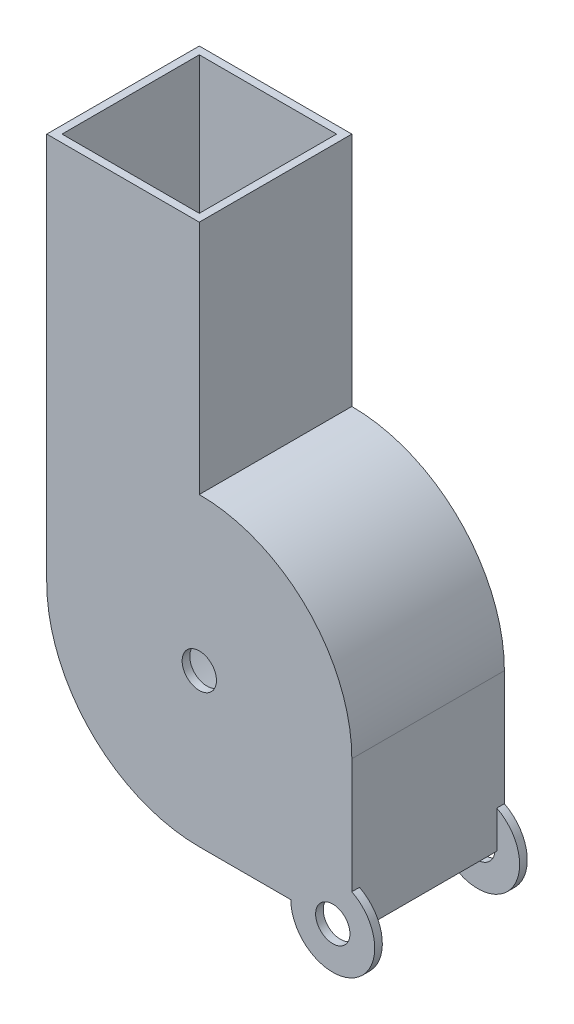
ISO-10303-21;
HEADER;
FILE_DESCRIPTION(('STEP AP214'),'2;1');
FILE_NAME('part.step','',(''),(''),'','','');
FILE_SCHEMA(('AUTOMOTIVE_DESIGN { 1 0 10303 214 1 1 1 1 }'));
ENDSEC;
DATA;
#1=APPLICATION_CONTEXT('core data for automotive mechanical design processes');
#2=APPLICATION_PROTOCOL_DEFINITION('international standard','automotive_design',2000,#1);
#3=PRODUCT_CONTEXT('',#1,'mechanical');
#4=PRODUCT('Part','Part','',(#3));
#5=PRODUCT_RELATED_PRODUCT_CATEGORY('part','',(#4));
#6=PRODUCT_DEFINITION_FORMATION('','',#4);
#7=PRODUCT_DEFINITION_CONTEXT('part definition',#1,'design');
#8=PRODUCT_DEFINITION('design','',#6,#7);
#9=PRODUCT_DEFINITION_SHAPE('','',#8);
#10=(LENGTH_UNIT() NAMED_UNIT(*) SI_UNIT(.MILLI.,.METRE.));
#11=(NAMED_UNIT(*) PLANE_ANGLE_UNIT() SI_UNIT($,.RADIAN.));
#12=(NAMED_UNIT(*) SI_UNIT($,.STERADIAN.) SOLID_ANGLE_UNIT());
#13=UNCERTAINTY_MEASURE_WITH_UNIT(LENGTH_MEASURE(1.E-05),#10,'distance_accuracy_value','');
#14=(GEOMETRIC_REPRESENTATION_CONTEXT(3) GLOBAL_UNCERTAINTY_ASSIGNED_CONTEXT((#13)) GLOBAL_UNIT_ASSIGNED_CONTEXT((#10,
#11,#12)) REPRESENTATION_CONTEXT('',''));
#15=CARTESIAN_POINT('',(0.,0.,0.));
#16=DIRECTION('',(0.,0.,1.));
#17=DIRECTION('',(1.,0.,0.));
#18=AXIS2_PLACEMENT_3D('',#15,#16,#17);
#19=CARTESIAN_POINT('',(0.,-40.,40.));
#20=DIRECTION('',(0.,1.,0.));
#21=DIRECTION('',(0.,0.,1.));
#22=AXIS2_PLACEMENT_3D('',#19,#20,#21);
#23=PLANE('',#22);
#24=DIRECTION('',(1.,0.,0.));
#25=VECTOR('',#24,1.);
#26=CARTESIAN_POINT('',(0.,-40.,38.));
#27=LINE('',#26,#25);
#28=CARTESIAN_POINT('',(39.5,-40.,38.));
#29=VERTEX_POINT('',#28);
#30=CARTESIAN_POINT('',(40.,-40.,38.));
#31=VERTEX_POINT('',#30);
#32=EDGE_CURVE('E184',#29,#31,#27,.T.);
#33=ORIENTED_EDGE('',*,*,#32,.F.);
#34=DIRECTION('',(0.,0.,1.));
#35=VECTOR('',#34,1.);
#36=CARTESIAN_POINT('',(39.5,-40.,0.));
#37=LINE('',#36,#35);
#38=CARTESIAN_POINT('',(39.5,-40.,2.));
#39=VERTEX_POINT('',#38);
#40=EDGE_CURVE('E174',#29,#39,#37,.F.);
#41=ORIENTED_EDGE('',*,*,#40,.T.);
#42=DIRECTION('',(1.,0.,0.));
#43=VECTOR('',#42,1.);
#44=CARTESIAN_POINT('',(0.,-40.,2.));
#45=LINE('',#44,#43);
#46=CARTESIAN_POINT('',(40.,-40.,2.));
#47=VERTEX_POINT('',#46);
#48=EDGE_CURVE('E182',#39,#47,#45,.T.);
#49=ORIENTED_EDGE('',*,*,#48,.T.);
#50=DIRECTION('',(0.,0.,-1.));
#51=VECTOR('',#50,1.);
#52=CARTESIAN_POINT('',(40.,-40.,40.));
#53=LINE('',#52,#51);
#54=EDGE_CURVE('E339',#31,#47,#53,.T.);
#55=ORIENTED_EDGE('',*,*,#54,.F.);
#56=EDGE_LOOP('',(#33,#41,#49,#55));
#57=FACE_BOUND('',#56,.T.);
#58=ADVANCED_FACE('F33',(#57),#23,.F.);
#59=CARTESIAN_POINT('',(-40.,101.855940277345,40.));
#60=DIRECTION('',(0.,-1.,0.));
#61=DIRECTION('',(0.,0.,-1.));
#62=AXIS2_PLACEMENT_3D('',#59,#60,#61);
#63=PLANE('',#62);
#64=DIRECTION('',(-1.,0.,0.));
#65=VECTOR('',#64,1.);
#66=CARTESIAN_POINT('',(-40.,101.855940277345,0.));
#67=LINE('',#66,#65);
#68=CARTESIAN_POINT('',(0.,101.855940277345,0.));
#69=VERTEX_POINT('',#68);
#70=CARTESIAN_POINT('',(-40.,101.855940277345,0.));
#71=VERTEX_POINT('',#70);
#72=EDGE_CURVE('E322',#69,#71,#67,.T.);
#73=ORIENTED_EDGE('',*,*,#72,.T.);
#74=DIRECTION('',(0.,0.,-1.));
#75=VECTOR('',#74,1.);
#76=CARTESIAN_POINT('',(-40.,101.855940277345,40.));
#77=LINE('',#76,#75);
#78=CARTESIAN_POINT('',(-40.,101.855940277345,40.));
#79=VERTEX_POINT('',#78);
#80=EDGE_CURVE('E327',#79,#71,#77,.T.);
#81=ORIENTED_EDGE('',*,*,#80,.F.);
#82=DIRECTION('',(-1.,0.,0.));
#83=VECTOR('',#82,1.);
#84=CARTESIAN_POINT('',(-40.,101.855940277345,40.));
#85=LINE('',#84,#83);
#86=CARTESIAN_POINT('',(0.,101.855940277345,40.));
#87=VERTEX_POINT('',#86);
#88=EDGE_CURVE('E306',#87,#79,#85,.T.);
#89=ORIENTED_EDGE('',*,*,#88,.F.);
#90=DIRECTION('',(0.,0.,-1.));
#91=VECTOR('',#90,1.);
#92=CARTESIAN_POINT('',(0.,101.855940277345,40.));
#93=LINE('',#92,#91);
#94=EDGE_CURVE('E330',#87,#69,#93,.T.);
#95=ORIENTED_EDGE('',*,*,#94,.T.);
#96=EDGE_LOOP('',(#73,#81,#89,#95));
#97=FACE_BOUND('',#96,.T.);
#98=DIRECTION('',(-1.,0.,0.));
#99=VECTOR('',#98,1.);
#100=CARTESIAN_POINT('',(-40.,101.855940277345,2.));
#101=LINE('',#100,#99);
#102=CARTESIAN_POINT('',(-2.,101.855940277345,2.));
#103=VERTEX_POINT('',#102);
#104=CARTESIAN_POINT('',(-38.,101.855940277345,2.));
#105=VERTEX_POINT('',#104);
#106=EDGE_CURVE('E280',#103,#105,#101,.T.);
#107=ORIENTED_EDGE('',*,*,#106,.F.);
#108=DIRECTION('',(0.,0.,-1.));
#109=VECTOR('',#108,1.);
#110=CARTESIAN_POINT('',(-2.,101.855940277345,40.));
#111=LINE('',#110,#109);
#112=CARTESIAN_POINT('',(-2.,101.855940277345,38.));
#113=VERTEX_POINT('',#112);
#114=EDGE_CURVE('E276',#113,#103,#111,.T.);
#115=ORIENTED_EDGE('',*,*,#114,.F.);
#116=DIRECTION('',(-1.,0.,0.));
#117=VECTOR('',#116,1.);
#118=CARTESIAN_POINT('',(-40.,101.855940277345,38.));
#119=LINE('',#118,#117);
#120=CARTESIAN_POINT('',(-38.,101.855940277345,38.));
#121=VERTEX_POINT('',#120);
#122=EDGE_CURVE('E283',#113,#121,#119,.T.);
#123=ORIENTED_EDGE('',*,*,#122,.T.);
#124=DIRECTION('',(0.,0.,-1.));
#125=VECTOR('',#124,1.);
#126=CARTESIAN_POINT('',(-38.,101.855940277345,40.));
#127=LINE('',#126,#125);
#128=EDGE_CURVE('E257',#121,#105,#127,.T.);
#129=ORIENTED_EDGE('',*,*,#128,.T.);
#130=EDGE_LOOP('',(#107,#115,#123,#129));
#131=FACE_BOUND('',#130,.T.);
#132=ADVANCED_FACE('F363',(#97,#131),#63,.F.);
#133=CARTESIAN_POINT('',(0.,0.,40.));
#134=DIRECTION('',(0.,0.,-1.));
#135=DIRECTION('',(-1.,0.,0.));
#136=AXIS2_PLACEMENT_3D('',#133,#134,#135);
#137=CYLINDRICAL_SURFACE('',#136,40.);
#138=CARTESIAN_POINT('',(0.,0.,0.));
#139=DIRECTION('',(0.,0.,1.));
#140=DIRECTION('',(1.,0.,0.));
#141=AXIS2_PLACEMENT_3D('',#138,#139,#140);
#142=CIRCLE('',#141,40.);
#143=CARTESIAN_POINT('',(-40.,0.,0.));
#144=VERTEX_POINT('',#143);
#145=CARTESIAN_POINT('',(0.,-40.,0.));
#146=VERTEX_POINT('',#145);
#147=EDGE_CURVE('E247',#144,#146,#142,.T.);
#148=ORIENTED_EDGE('',*,*,#147,.T.);
#149=DIRECTION('',(0.,0.,-1.));
#150=VECTOR('',#149,1.);
#151=CARTESIAN_POINT('',(0.,-40.,40.));
#152=LINE('',#151,#150);
#153=CARTESIAN_POINT('',(0.,-40.,40.));
#154=VERTEX_POINT('',#153);
#155=EDGE_CURVE('E41',#154,#146,#152,.T.);
#156=ORIENTED_EDGE('',*,*,#155,.F.);
#157=CARTESIAN_POINT('',(0.,0.,40.));
#158=DIRECTION('',(0.,0.,1.));
#159=DIRECTION('',(1.,0.,0.));
#160=AXIS2_PLACEMENT_3D('',#157,#158,#159);
#161=CIRCLE('',#160,40.);
#162=CARTESIAN_POINT('',(-40.,0.,40.));
#163=VERTEX_POINT('',#162);
#164=EDGE_CURVE('E293',#163,#154,#161,.T.);
#165=ORIENTED_EDGE('',*,*,#164,.F.);
#166=DIRECTION('',(0.,0.,-1.));
#167=VECTOR('',#166,1.);
#168=CARTESIAN_POINT('',(-40.,0.,40.));
#169=LINE('',#168,#167);
#170=EDGE_CURVE('E310',#163,#144,#169,.T.);
#171=ORIENTED_EDGE('',*,*,#170,.T.);
#172=EDGE_LOOP('',(#148,#156,#165,#171));
#173=FACE_BOUND('',#172,.T.);
#174=ADVANCED_FACE('F35',(#173),#137,.T.);
#175=DIRECTION('',(1.,0.,0.));
#176=VECTOR('',#175,1.);
#177=CARTESIAN_POINT('',(0.,-40.,0.));
#178=LINE('',#177,#176);
#179=CARTESIAN_POINT('',(24.,-40.,0.));
#180=VERTEX_POINT('',#179);
#181=EDGE_CURVE('E313',#146,#180,#178,.T.);
#182=ORIENTED_EDGE('',*,*,#181,.T.);
#183=DIRECTION('',(0.,0.,-1.));
#184=VECTOR('',#183,1.);
#185=CARTESIAN_POINT('',(24.,-40.,33.1126983722081));
#186=LINE('',#185,#184);
#187=CARTESIAN_POINT('',(24.,-40.,2.));
#188=VERTEX_POINT('',#187);
#189=EDGE_CURVE('E193',#180,#188,#186,.F.);
#190=ORIENTED_EDGE('',*,*,#189,.T.);
#191=DIRECTION('',(1.,0.,0.));
#192=VECTOR('',#191,1.);
#193=CARTESIAN_POINT('',(2.,-40.,2.));
#194=LINE('',#193,#192);
#195=CARTESIAN_POINT('',(2.,-40.,2.));
#196=VERTEX_POINT('',#195);
#197=EDGE_CURVE('E230',#196,#188,#194,.T.);
#198=ORIENTED_EDGE('',*,*,#197,.F.);
#199=DIRECTION('',(0.,0.,-1.));
#200=VECTOR('',#199,1.);
#201=CARTESIAN_POINT('',(2.,-40.,38.));
#202=LINE('',#201,#200);
#203=CARTESIAN_POINT('',(2.,-40.,38.));
#204=VERTEX_POINT('',#203);
#205=EDGE_CURVE('E227',#204,#196,#202,.T.);
#206=ORIENTED_EDGE('',*,*,#205,.F.);
#207=DIRECTION('',(-1.,0.,0.));
#208=VECTOR('',#207,1.);
#209=CARTESIAN_POINT('',(38.,-40.,38.));
#210=LINE('',#209,#208);
#211=CARTESIAN_POINT('',(24.,-40.,38.));
#212=VERTEX_POINT('',#211);
#213=EDGE_CURVE('E225',#212,#204,#210,.T.);
#214=ORIENTED_EDGE('',*,*,#213,.F.);
#215=DIRECTION('',(0.,0.,1.));
#216=VECTOR('',#215,1.);
#217=CARTESIAN_POINT('',(24.,-40.,6.88730162779193));
#218=LINE('',#217,#216);
#219=CARTESIAN_POINT('',(24.,-40.,40.));
#220=VERTEX_POINT('',#219);
#221=EDGE_CURVE('E219',#212,#220,#218,.T.);
#222=ORIENTED_EDGE('',*,*,#221,.T.);
#223=DIRECTION('',(1.,0.,0.));
#224=VECTOR('',#223,1.);
#225=CARTESIAN_POINT('',(0.,-40.,40.));
#226=LINE('',#225,#224);
#227=EDGE_CURVE('E296',#154,#220,#226,.T.);
#228=ORIENTED_EDGE('',*,*,#227,.F.);
#229=ORIENTED_EDGE('',*,*,#155,.T.);
#230=EDGE_LOOP('',(#182,#190,#198,#206,#214,#222,#228,#229));
#231=FACE_BOUND('',#230,.T.);
#232=ADVANCED_FACE('F364',(#231),#23,.F.);
#233=CARTESIAN_POINT('',(40.,0.,40.));
#234=DIRECTION('',(-1.,0.,0.));
#235=DIRECTION('',(0.,-1.,0.));
#236=AXIS2_PLACEMENT_3D('',#233,#234,#235);
#237=PLANE('',#236);
#238=ORIENTED_EDGE('',*,*,#54,.T.);
#239=DIRECTION('',(0.,1.,0.));
#240=VECTOR('',#239,1.);
#241=CARTESIAN_POINT('',(40.,0.,2.));
#242=LINE('',#241,#240);
#243=CARTESIAN_POINT('',(40.,-30.2020410288673,2.));
#244=VERTEX_POINT('',#243);
#245=EDGE_CURVE('E191',#47,#244,#242,.T.);
#246=ORIENTED_EDGE('',*,*,#245,.T.);
#247=DIRECTION('',(0.,0.,-1.));
#248=VECTOR('',#247,1.);
#249=CARTESIAN_POINT('',(40.,-30.2020410288673,33.1126983722081));
#250=LINE('',#249,#248);
#251=CARTESIAN_POINT('',(40.,-30.2020410288673,0.));
#252=VERTEX_POINT('',#251);
#253=EDGE_CURVE('E198',#244,#252,#250,.T.);
#254=ORIENTED_EDGE('',*,*,#253,.T.);
#255=DIRECTION('',(0.,1.,0.));
#256=VECTOR('',#255,1.);
#257=CARTESIAN_POINT('',(40.,0.,0.));
#258=LINE('',#257,#256);
#259=CARTESIAN_POINT('',(40.,0.,0.));
#260=VERTEX_POINT('',#259);
#261=EDGE_CURVE('E316',#252,#260,#258,.T.);
#262=ORIENTED_EDGE('',*,*,#261,.T.);
#263=DIRECTION('',(0.,0.,-1.));
#264=VECTOR('',#263,1.);
#265=CARTESIAN_POINT('',(40.,0.,40.));
#266=LINE('',#265,#264);
#267=CARTESIAN_POINT('',(40.,0.,40.));
#268=VERTEX_POINT('',#267);
#269=EDGE_CURVE('E336',#268,#260,#266,.T.);
#270=ORIENTED_EDGE('',*,*,#269,.F.);
#271=DIRECTION('',(0.,1.,0.));
#272=VECTOR('',#271,1.);
#273=CARTESIAN_POINT('',(40.,0.,40.));
#274=LINE('',#273,#272);
#275=CARTESIAN_POINT('',(40.,-30.2020410288673,40.));
#276=VERTEX_POINT('',#275);
#277=EDGE_CURVE('E300',#276,#268,#274,.T.);
#278=ORIENTED_EDGE('',*,*,#277,.F.);
#279=DIRECTION('',(0.,0.,1.));
#280=VECTOR('',#279,1.);
#281=CARTESIAN_POINT('',(40.,-30.2020410288673,6.88730162779193));
#282=LINE('',#281,#280);
#283=CARTESIAN_POINT('',(40.,-30.2020410288673,38.));
#284=VERTEX_POINT('',#283);
#285=EDGE_CURVE('E217',#276,#284,#282,.F.);
#286=ORIENTED_EDGE('',*,*,#285,.T.);
#287=DIRECTION('',(0.,1.,0.));
#288=VECTOR('',#287,1.);
#289=CARTESIAN_POINT('',(40.,0.,38.));
#290=LINE('',#289,#288);
#291=EDGE_CURVE('E222',#31,#284,#290,.T.);
#292=ORIENTED_EDGE('',*,*,#291,.F.);
#293=EDGE_LOOP('',(#238,#246,#254,#262,#270,#278,#286,#292));
#294=FACE_BOUND('',#293,.T.);
#295=ADVANCED_FACE('F372',(#294),#237,.F.);
#296=CARTESIAN_POINT('',(0.,0.,40.));
#297=DIRECTION('',(0.,0.,-1.));
#298=DIRECTION('',(-1.,0.,0.));
#299=AXIS2_PLACEMENT_3D('',#296,#297,#298);
#300=CYLINDRICAL_SURFACE('',#299,40.);
#301=CARTESIAN_POINT('',(0.,0.,0.));
#302=DIRECTION('',(0.,0.,1.));
#303=DIRECTION('',(1.,0.,0.));
#304=AXIS2_PLACEMENT_3D('',#301,#302,#303);
#305=CIRCLE('',#304,40.);
#306=CARTESIAN_POINT('',(0.,40.,0.));
#307=VERTEX_POINT('',#306);
#308=EDGE_CURVE('E318',#260,#307,#305,.T.);
#309=ORIENTED_EDGE('',*,*,#308,.T.);
#310=DIRECTION('',(0.,0.,-1.));
#311=VECTOR('',#310,1.);
#312=CARTESIAN_POINT('',(0.,40.,40.));
#313=LINE('',#312,#311);
#314=CARTESIAN_POINT('',(0.,40.,40.));
#315=VERTEX_POINT('',#314);
#316=EDGE_CURVE('E333',#315,#307,#313,.T.);
#317=ORIENTED_EDGE('',*,*,#316,.F.);
#318=CARTESIAN_POINT('',(0.,0.,40.));
#319=DIRECTION('',(0.,0.,1.));
#320=DIRECTION('',(1.,0.,0.));
#321=AXIS2_PLACEMENT_3D('',#318,#319,#320);
#322=CIRCLE('',#321,40.);
#323=EDGE_CURVE('E302',#268,#315,#322,.T.);
#324=ORIENTED_EDGE('',*,*,#323,.F.);
#325=ORIENTED_EDGE('',*,*,#269,.T.);
#326=EDGE_LOOP('',(#309,#317,#324,#325));
#327=FACE_BOUND('',#326,.T.);
#328=ADVANCED_FACE('F378',(#327),#300,.T.);
#329=CARTESIAN_POINT('',(0.,101.855940277345,40.));
#330=DIRECTION('',(-1.,0.,0.));
#331=DIRECTION('',(0.,0.,1.));
#332=AXIS2_PLACEMENT_3D('',#329,#330,#331);
#333=PLANE('',#332);
#334=DIRECTION('',(0.,1.,0.));
#335=VECTOR('',#334,1.);
#336=CARTESIAN_POINT('',(0.,101.855940277345,0.));
#337=LINE('',#336,#335);
#338=EDGE_CURVE('E320',#307,#69,#337,.T.);
#339=ORIENTED_EDGE('',*,*,#338,.T.);
#340=ORIENTED_EDGE('',*,*,#94,.F.);
#341=DIRECTION('',(0.,1.,0.));
#342=VECTOR('',#341,1.);
#343=CARTESIAN_POINT('',(0.,101.855940277345,40.));
#344=LINE('',#343,#342);
#345=EDGE_CURVE('E304',#315,#87,#344,.T.);
#346=ORIENTED_EDGE('',*,*,#345,.F.);
#347=ORIENTED_EDGE('',*,*,#316,.T.);
#348=EDGE_LOOP('',(#339,#340,#346,#347));
#349=FACE_BOUND('',#348,.T.);
#350=ADVANCED_FACE('F457',(#349),#333,.F.);
#351=CARTESIAN_POINT('',(-40.,0.,40.));
#352=DIRECTION('',(1.,0.,0.));
#353=DIRECTION('',(0.,0.,-1.));
#354=AXIS2_PLACEMENT_3D('',#351,#352,#353);
#355=PLANE('',#354);
#356=DIRECTION('',(0.,-1.,0.));
#357=VECTOR('',#356,1.);
#358=CARTESIAN_POINT('',(-40.,0.,0.));
#359=LINE('',#358,#357);
#360=EDGE_CURVE('E297',#71,#144,#359,.T.);
#361=ORIENTED_EDGE('',*,*,#360,.T.);
#362=ORIENTED_EDGE('',*,*,#170,.F.);
#363=DIRECTION('',(0.,-1.,0.));
#364=VECTOR('',#363,1.);
#365=CARTESIAN_POINT('',(-40.,0.,40.));
#366=LINE('',#365,#364);
#367=EDGE_CURVE('E308',#79,#163,#366,.T.);
#368=ORIENTED_EDGE('',*,*,#367,.F.);
#369=ORIENTED_EDGE('',*,*,#80,.T.);
#370=EDGE_LOOP('',(#361,#362,#368,#369));
#371=FACE_BOUND('',#370,.T.);
#372=ADVANCED_FACE('F441',(#371),#355,.F.);
#373=CARTESIAN_POINT('',(0.,0.,40.));
#374=DIRECTION('',(0.,0.,1.));
#375=DIRECTION('',(1.,0.,0.));
#376=AXIS2_PLACEMENT_3D('',#373,#374,#375);
#377=PLANE('',#376);
#378=CARTESIAN_POINT('',(35.,-40.,40.));
#379=DIRECTION('',(0.,0.,1.));
#380=DIRECTION('',(1.,0.,0.));
#381=AXIS2_PLACEMENT_3D('',#378,#379,#380);
#382=CIRCLE('',#381,4.5);
#383=CARTESIAN_POINT('',(39.5,-40.,40.));
#384=VERTEX_POINT('',#383);
#385=EDGE_CURVE('E430',#384,#384,#382,.T.);
#386=ORIENTED_EDGE('',*,*,#385,.F.);
#387=EDGE_LOOP('',(#386));
#388=FACE_BOUND('',#387,.T.);
#389=CARTESIAN_POINT('',(0.,0.,40.));
#390=DIRECTION('',(0.,0.,1.));
#391=DIRECTION('',(1.,0.,0.));
#392=AXIS2_PLACEMENT_3D('',#389,#390,#391);
#393=CIRCLE('',#392,4.5);
#394=CARTESIAN_POINT('',(4.5,0.,40.));
#395=VERTEX_POINT('',#394);
#396=EDGE_CURVE('E195',#395,#395,#393,.T.);
#397=ORIENTED_EDGE('',*,*,#396,.F.);
#398=EDGE_LOOP('',(#397));
#399=FACE_BOUND('',#398,.T.);
#400=ORIENTED_EDGE('',*,*,#227,.T.);
#401=CARTESIAN_POINT('',(35.,-40.,40.));
#402=DIRECTION('',(0.,0.,1.));
#403=DIRECTION('',(1.,0.,0.));
#404=AXIS2_PLACEMENT_3D('',#401,#402,#403);
#405=CIRCLE('',#404,11.);
#406=EDGE_CURVE('E211',#220,#276,#405,.T.);
#407=ORIENTED_EDGE('',*,*,#406,.T.);
#408=ORIENTED_EDGE('',*,*,#277,.T.);
#409=ORIENTED_EDGE('',*,*,#323,.T.);
#410=ORIENTED_EDGE('',*,*,#345,.T.);
#411=ORIENTED_EDGE('',*,*,#88,.T.);
#412=ORIENTED_EDGE('',*,*,#367,.T.);
#413=ORIENTED_EDGE('',*,*,#164,.T.);
#414=EDGE_LOOP('',(#400,#407,#408,#409,#410,#411,#412,#413));
#415=FACE_BOUND('',#414,.T.);
#416=ADVANCED_FACE('F438',(#388,#399,#415),#377,.T.);
#417=CARTESIAN_POINT('',(0.,0.,0.));
#418=DIRECTION('',(0.,0.,1.));
#419=DIRECTION('',(1.,0.,0.));
#420=AXIS2_PLACEMENT_3D('',#417,#418,#419);
#421=PLANE('',#420);
#422=CARTESIAN_POINT('',(35.,-40.,0.));
#423=DIRECTION('',(0.,0.,1.));
#424=DIRECTION('',(1.,0.,0.));
#425=AXIS2_PLACEMENT_3D('',#422,#423,#424);
#426=CIRCLE('',#425,4.5);
#427=CARTESIAN_POINT('',(39.5,-40.,0.));
#428=VERTEX_POINT('',#427);
#429=EDGE_CURVE('E427',#428,#428,#426,.T.);
#430=ORIENTED_EDGE('',*,*,#429,.T.);
#431=EDGE_LOOP('',(#430));
#432=FACE_BOUND('',#431,.T.);
#433=CARTESIAN_POINT('',(0.,0.,0.));
#434=DIRECTION('',(0.,0.,1.));
#435=DIRECTION('',(1.,0.,0.));
#436=AXIS2_PLACEMENT_3D('',#433,#434,#435);
#437=CIRCLE('',#436,4.5);
#438=CARTESIAN_POINT('',(4.5,0.,0.));
#439=VERTEX_POINT('',#438);
#440=EDGE_CURVE('E204',#439,#439,#437,.F.);
#441=ORIENTED_EDGE('',*,*,#440,.F.);
#442=EDGE_LOOP('',(#441));
#443=FACE_BOUND('',#442,.T.);
#444=ORIENTED_EDGE('',*,*,#261,.F.);
#445=CARTESIAN_POINT('',(35.,-40.,0.));
#446=DIRECTION('',(0.,0.,-1.));
#447=DIRECTION('',(-1.,0.,0.));
#448=AXIS2_PLACEMENT_3D('',#445,#446,#447);
#449=CIRCLE('',#448,11.);
#450=EDGE_CURVE('E55',#252,#180,#449,.T.);
#451=ORIENTED_EDGE('',*,*,#450,.T.);
#452=ORIENTED_EDGE('',*,*,#181,.F.);
#453=ORIENTED_EDGE('',*,*,#147,.F.);
#454=ORIENTED_EDGE('',*,*,#360,.F.);
#455=ORIENTED_EDGE('',*,*,#72,.F.);
#456=ORIENTED_EDGE('',*,*,#338,.F.);
#457=ORIENTED_EDGE('',*,*,#308,.F.);
#458=EDGE_LOOP('',(#444,#451,#452,#453,#454,#455,#456,#457));
#459=FACE_BOUND('',#458,.T.);
#460=ADVANCED_FACE('F386',(#432,#443,#459),#421,.F.);
#461=CARTESIAN_POINT('',(0.,0.,40.));
#462=DIRECTION('',(0.,0.,-1.));
#463=DIRECTION('',(-1.,0.,0.));
#464=AXIS2_PLACEMENT_3D('',#461,#462,#463);
#465=CYLINDRICAL_SURFACE('',#464,38.);
#466=CARTESIAN_POINT('',(0.,0.,2.));
#467=DIRECTION('',(0.,0.,1.));
#468=DIRECTION('',(1.,0.,0.));
#469=AXIS2_PLACEMENT_3D('',#466,#467,#468);
#470=CIRCLE('',#469,38.);
#471=CARTESIAN_POINT('',(-38.,0.,2.));
#472=VERTEX_POINT('',#471);
#473=CARTESIAN_POINT('',(0.,-38.,2.));
#474=VERTEX_POINT('',#473);
#475=EDGE_CURVE('E240',#472,#474,#470,.T.);
#476=ORIENTED_EDGE('',*,*,#475,.F.);
#477=DIRECTION('',(0.,0.,-1.));
#478=VECTOR('',#477,1.);
#479=CARTESIAN_POINT('',(-38.,0.,40.));
#480=LINE('',#479,#478);
#481=CARTESIAN_POINT('',(-38.,0.,38.));
#482=VERTEX_POINT('',#481);
#483=EDGE_CURVE('E254',#482,#472,#480,.T.);
#484=ORIENTED_EDGE('',*,*,#483,.F.);
#485=CARTESIAN_POINT('',(0.,0.,38.));
#486=DIRECTION('',(0.,0.,1.));
#487=DIRECTION('',(1.,0.,0.));
#488=AXIS2_PLACEMENT_3D('',#485,#486,#487);
#489=CIRCLE('',#488,38.);
#490=CARTESIAN_POINT('',(0.,-38.,38.));
#491=VERTEX_POINT('',#490);
#492=EDGE_CURVE('E249',#482,#491,#489,.T.);
#493=ORIENTED_EDGE('',*,*,#492,.T.);
#494=DIRECTION('',(0.,0.,1.));
#495=VECTOR('',#494,1.);
#496=CARTESIAN_POINT('',(0.,-38.,40.));
#497=LINE('',#496,#495);
#498=EDGE_CURVE('E244',#491,#474,#497,.F.);
#499=ORIENTED_EDGE('',*,*,#498,.T.);
#500=EDGE_LOOP('',(#476,#484,#493,#499));
#501=FACE_BOUND('',#500,.T.);
#502=ADVANCED_FACE('F407',(#501),#465,.F.);
#503=CARTESIAN_POINT('',(0.,-38.,40.));
#504=DIRECTION('',(0.,1.,0.));
#505=DIRECTION('',(0.,0.,1.));
#506=AXIS2_PLACEMENT_3D('',#503,#504,#505);
#507=PLANE('',#506);
#508=DIRECTION('',(0.,0.,1.));
#509=VECTOR('',#508,1.);
#510=CARTESIAN_POINT('',(2.,-38.,40.));
#511=LINE('',#510,#509);
#512=CARTESIAN_POINT('',(2.,-38.,2.));
#513=VERTEX_POINT('',#512);
#514=CARTESIAN_POINT('',(2.,-38.,38.));
#515=VERTEX_POINT('',#514);
#516=EDGE_CURVE('E236',#513,#515,#511,.T.);
#517=ORIENTED_EDGE('',*,*,#516,.F.);
#518=DIRECTION('',(1.,0.,0.));
#519=VECTOR('',#518,1.);
#520=CARTESIAN_POINT('',(0.,-38.,2.));
#521=LINE('',#520,#519);
#522=EDGE_CURVE('E243',#474,#513,#521,.T.);
#523=ORIENTED_EDGE('',*,*,#522,.F.);
#524=ORIENTED_EDGE('',*,*,#498,.F.);
#525=DIRECTION('',(1.,0.,0.));
#526=VECTOR('',#525,1.);
#527=CARTESIAN_POINT('',(0.,-38.,38.));
#528=LINE('',#527,#526);
#529=EDGE_CURVE('E252',#491,#515,#528,.T.);
#530=ORIENTED_EDGE('',*,*,#529,.T.);
#531=EDGE_LOOP('',(#517,#523,#524,#530));
#532=FACE_BOUND('',#531,.T.);
#533=ADVANCED_FACE('F404',(#532),#507,.T.);
#534=CARTESIAN_POINT('',(38.,0.,40.));
#535=DIRECTION('',(-1.,0.,0.));
#536=DIRECTION('',(0.,-1.,0.));
#537=AXIS2_PLACEMENT_3D('',#534,#535,#536);
#538=PLANE('',#537);
#539=DIRECTION('',(0.,0.,1.));
#540=VECTOR('',#539,1.);
#541=CARTESIAN_POINT('',(38.,-36.6458980337503,0.));
#542=LINE('',#541,#540);
#543=CARTESIAN_POINT('',(38.,-36.6458980337503,38.));
#544=VERTEX_POINT('',#543);
#545=CARTESIAN_POINT('',(38.,-36.6458980337503,2.));
#546=VERTEX_POINT('',#545);
#547=EDGE_CURVE('E47',#544,#546,#542,.F.);
#548=ORIENTED_EDGE('',*,*,#547,.F.);
#549=DIRECTION('',(0.,1.,0.));
#550=VECTOR('',#549,1.);
#551=CARTESIAN_POINT('',(38.,0.,38.));
#552=LINE('',#551,#550);
#553=CARTESIAN_POINT('',(38.,0.,38.));
#554=VERTEX_POINT('',#553);
#555=EDGE_CURVE('E264',#544,#554,#552,.T.);
#556=ORIENTED_EDGE('',*,*,#555,.T.);
#557=DIRECTION('',(0.,0.,-1.));
#558=VECTOR('',#557,1.);
#559=CARTESIAN_POINT('',(38.,0.,40.));
#560=LINE('',#559,#558);
#561=CARTESIAN_POINT('',(38.,0.,2.));
#562=VERTEX_POINT('',#561);
#563=EDGE_CURVE('E248',#554,#562,#560,.T.);
#564=ORIENTED_EDGE('',*,*,#563,.T.);
#565=DIRECTION('',(0.,1.,0.));
#566=VECTOR('',#565,1.);
#567=CARTESIAN_POINT('',(38.,0.,2.));
#568=LINE('',#567,#566);
#569=EDGE_CURVE('E261',#546,#562,#568,.T.);
#570=ORIENTED_EDGE('',*,*,#569,.F.);
#571=EDGE_LOOP('',(#548,#556,#564,#570));
#572=FACE_BOUND('',#571,.T.);
#573=ADVANCED_FACE('F426',(#572),#538,.T.);
#574=CARTESIAN_POINT('',(0.,0.,40.));
#575=DIRECTION('',(0.,0.,-1.));
#576=DIRECTION('',(-1.,0.,0.));
#577=AXIS2_PLACEMENT_3D('',#574,#575,#576);
#578=CYLINDRICAL_SURFACE('',#577,38.);
#579=CARTESIAN_POINT('',(0.,0.,2.));
#580=DIRECTION('',(0.,0.,1.));
#581=DIRECTION('',(1.,0.,0.));
#582=AXIS2_PLACEMENT_3D('',#579,#580,#581);
#583=CIRCLE('',#582,38.);
#584=CARTESIAN_POINT('',(-2.,37.9473319220206,2.));
#585=VERTEX_POINT('',#584);
#586=EDGE_CURVE('E266',#562,#585,#583,.T.);
#587=ORIENTED_EDGE('',*,*,#586,.F.);
#588=ORIENTED_EDGE('',*,*,#563,.F.);
#589=CARTESIAN_POINT('',(0.,0.,38.));
#590=DIRECTION('',(0.,0.,1.));
#591=DIRECTION('',(1.,0.,0.));
#592=AXIS2_PLACEMENT_3D('',#589,#590,#591);
#593=CIRCLE('',#592,38.);
#594=CARTESIAN_POINT('',(-2.,37.9473319220206,38.));
#595=VERTEX_POINT('',#594);
#596=EDGE_CURVE('E271',#554,#595,#593,.T.);
#597=ORIENTED_EDGE('',*,*,#596,.T.);
#598=DIRECTION('',(0.,0.,-1.));
#599=VECTOR('',#598,1.);
#600=CARTESIAN_POINT('',(-2.,37.9473319220206,38.));
#601=LINE('',#600,#599);
#602=EDGE_CURVE('E269',#595,#585,#601,.T.);
#603=ORIENTED_EDGE('',*,*,#602,.T.);
#604=EDGE_LOOP('',(#587,#588,#597,#603));
#605=FACE_BOUND('',#604,.T.);
#606=ADVANCED_FACE('F424',(#605),#578,.F.);
#607=CARTESIAN_POINT('',(-2.,101.855940277345,40.));
#608=DIRECTION('',(-1.,0.,0.));
#609=DIRECTION('',(0.,0.,1.));
#610=AXIS2_PLACEMENT_3D('',#607,#608,#609);
#611=PLANE('',#610);
#612=DIRECTION('',(0.,1.,0.));
#613=VECTOR('',#612,1.);
#614=CARTESIAN_POINT('',(-2.,101.855940277345,2.));
#615=LINE('',#614,#613);
#616=EDGE_CURVE('E273',#585,#103,#615,.T.);
#617=ORIENTED_EDGE('',*,*,#616,.F.);
#618=ORIENTED_EDGE('',*,*,#602,.F.);
#619=DIRECTION('',(0.,1.,0.));
#620=VECTOR('',#619,1.);
#621=CARTESIAN_POINT('',(-2.,101.855940277345,38.));
#622=LINE('',#621,#620);
#623=EDGE_CURVE('E278',#595,#113,#622,.T.);
#624=ORIENTED_EDGE('',*,*,#623,.T.);
#625=ORIENTED_EDGE('',*,*,#114,.T.);
#626=EDGE_LOOP('',(#617,#618,#624,#625));
#627=FACE_BOUND('',#626,.T.);
#628=ADVANCED_FACE('F418',(#627),#611,.T.);
#629=CARTESIAN_POINT('',(-38.,0.,40.));
#630=DIRECTION('',(1.,0.,0.));
#631=DIRECTION('',(0.,0.,-1.));
#632=AXIS2_PLACEMENT_3D('',#629,#630,#631);
#633=PLANE('',#632);
#634=DIRECTION('',(0.,-1.,0.));
#635=VECTOR('',#634,1.);
#636=CARTESIAN_POINT('',(-38.,0.,2.));
#637=LINE('',#636,#635);
#638=EDGE_CURVE('E253',#105,#472,#637,.T.);
#639=ORIENTED_EDGE('',*,*,#638,.F.);
#640=ORIENTED_EDGE('',*,*,#128,.F.);
#641=DIRECTION('',(0.,-1.,0.));
#642=VECTOR('',#641,1.);
#643=CARTESIAN_POINT('',(-38.,0.,38.));
#644=LINE('',#643,#642);
#645=EDGE_CURVE('E258',#121,#482,#644,.T.);
#646=ORIENTED_EDGE('',*,*,#645,.T.);
#647=ORIENTED_EDGE('',*,*,#483,.T.);
#648=EDGE_LOOP('',(#639,#640,#646,#647));
#649=FACE_BOUND('',#648,.T.);
#650=ADVANCED_FACE('F358',(#649),#633,.T.);
#651=CARTESIAN_POINT('',(0.,0.,38.));
#652=DIRECTION('',(0.,0.,1.));
#653=DIRECTION('',(1.,0.,0.));
#654=AXIS2_PLACEMENT_3D('',#651,#652,#653);
#655=PLANE('',#654);
#656=CARTESIAN_POINT('',(0.,0.,38.));
#657=DIRECTION('',(0.,0.,1.));
#658=DIRECTION('',(1.,0.,0.));
#659=AXIS2_PLACEMENT_3D('',#656,#657,#658);
#660=CIRCLE('',#659,4.5);
#661=CARTESIAN_POINT('',(4.5,0.,38.));
#662=VERTEX_POINT('',#661);
#663=EDGE_CURVE('E208',#662,#662,#660,.T.);
#664=ORIENTED_EDGE('',*,*,#663,.T.);
#665=EDGE_LOOP('',(#664));
#666=FACE_BOUND('',#665,.T.);
#667=ORIENTED_EDGE('',*,*,#555,.F.);
#668=CARTESIAN_POINT('',(35.,-40.,38.));
#669=DIRECTION('',(0.,0.,1.));
#670=DIRECTION('',(1.,0.,0.));
#671=AXIS2_PLACEMENT_3D('',#668,#669,#670);
#672=CIRCLE('',#671,4.5);
#673=EDGE_CURVE('E185',#544,#29,#672,.T.);
#674=ORIENTED_EDGE('',*,*,#673,.T.);
#675=ORIENTED_EDGE('',*,*,#32,.T.);
#676=ORIENTED_EDGE('',*,*,#291,.T.);
#677=CARTESIAN_POINT('',(35.,-40.,38.));
#678=DIRECTION('',(0.,0.,1.));
#679=DIRECTION('',(1.,0.,0.));
#680=AXIS2_PLACEMENT_3D('',#677,#678,#679);
#681=CIRCLE('',#680,11.);
#682=EDGE_CURVE('E214',#284,#212,#681,.F.);
#683=ORIENTED_EDGE('',*,*,#682,.T.);
#684=ORIENTED_EDGE('',*,*,#213,.T.);
#685=DIRECTION('',(0.,-1.,0.));
#686=VECTOR('',#685,1.);
#687=CARTESIAN_POINT('',(2.,0.,38.));
#688=LINE('',#687,#686);
#689=EDGE_CURVE('E233',#515,#204,#688,.T.);
#690=ORIENTED_EDGE('',*,*,#689,.F.);
#691=ORIENTED_EDGE('',*,*,#529,.F.);
#692=ORIENTED_EDGE('',*,*,#492,.F.);
#693=ORIENTED_EDGE('',*,*,#645,.F.);
#694=ORIENTED_EDGE('',*,*,#122,.F.);
#695=ORIENTED_EDGE('',*,*,#623,.F.);
#696=ORIENTED_EDGE('',*,*,#596,.F.);
#697=EDGE_LOOP('',(#667,#674,#675,#676,#683,#684,#690,#691,#692,#693,#694,#695,#696));
#698=FACE_BOUND('',#697,.T.);
#699=ADVANCED_FACE('F349',(#666,#698),#655,.F.);
#700=CARTESIAN_POINT('',(0.,0.,2.));
#701=DIRECTION('',(0.,0.,1.));
#702=DIRECTION('',(1.,0.,0.));
#703=AXIS2_PLACEMENT_3D('',#700,#701,#702);
#704=PLANE('',#703);
#705=CARTESIAN_POINT('',(35.,-40.,2.));
#706=DIRECTION('',(0.,0.,1.));
#707=DIRECTION('',(1.,0.,0.));
#708=AXIS2_PLACEMENT_3D('',#705,#706,#707);
#709=CIRCLE('',#708,4.5);
#710=EDGE_CURVE('E11',#546,#39,#709,.T.);
#711=ORIENTED_EDGE('',*,*,#710,.F.);
#712=ORIENTED_EDGE('',*,*,#569,.T.);
#713=ORIENTED_EDGE('',*,*,#586,.T.);
#714=ORIENTED_EDGE('',*,*,#616,.T.);
#715=ORIENTED_EDGE('',*,*,#106,.T.);
#716=ORIENTED_EDGE('',*,*,#638,.T.);
#717=ORIENTED_EDGE('',*,*,#475,.T.);
#718=ORIENTED_EDGE('',*,*,#522,.T.);
#719=DIRECTION('',(0.,-1.,0.));
#720=VECTOR('',#719,1.);
#721=CARTESIAN_POINT('',(2.,0.,2.));
#722=LINE('',#721,#720);
#723=EDGE_CURVE('E234',#513,#196,#722,.T.);
#724=ORIENTED_EDGE('',*,*,#723,.T.);
#725=ORIENTED_EDGE('',*,*,#197,.T.);
#726=CARTESIAN_POINT('',(35.,-40.,2.));
#727=DIRECTION('',(0.,0.,1.));
#728=DIRECTION('',(1.,0.,0.));
#729=AXIS2_PLACEMENT_3D('',#726,#727,#728);
#730=CIRCLE('',#729,11.);
#731=EDGE_CURVE('E389',#244,#188,#730,.F.);
#732=ORIENTED_EDGE('',*,*,#731,.F.);
#733=ORIENTED_EDGE('',*,*,#245,.F.);
#734=ORIENTED_EDGE('',*,*,#48,.F.);
#735=EDGE_LOOP('',(#711,#712,#713,#714,#715,#716,#717,#718,#724,#725,#732,#733,#734));
#736=FACE_BOUND('',#735,.T.);
#737=CARTESIAN_POINT('',(0.,0.,2.));
#738=DIRECTION('',(0.,0.,1.));
#739=DIRECTION('',(1.,0.,0.));
#740=AXIS2_PLACEMENT_3D('',#737,#738,#739);
#741=CIRCLE('',#740,4.5);
#742=CARTESIAN_POINT('',(4.5,0.,2.));
#743=VERTEX_POINT('',#742);
#744=EDGE_CURVE('E207',#743,#743,#741,.T.);
#745=ORIENTED_EDGE('',*,*,#744,.F.);
#746=EDGE_LOOP('',(#745));
#747=FACE_BOUND('',#746,.T.);
#748=ADVANCED_FACE('F187',(#736,#747),#704,.T.);
#749=CARTESIAN_POINT('',(2.,0.,38.));
#750=DIRECTION('',(-1.,0.,0.));
#751=DIRECTION('',(0.,0.,1.));
#752=AXIS2_PLACEMENT_3D('',#749,#750,#751);
#753=PLANE('',#752);
#754=ORIENTED_EDGE('',*,*,#516,.T.);
#755=ORIENTED_EDGE('',*,*,#689,.T.);
#756=ORIENTED_EDGE('',*,*,#205,.T.);
#757=ORIENTED_EDGE('',*,*,#723,.F.);
#758=EDGE_LOOP('',(#754,#755,#756,#757));
#759=FACE_BOUND('',#758,.T.);
#760=ADVANCED_FACE('F348',(#759),#753,.F.);
#761=CARTESIAN_POINT('',(35.,-40.,6.88730162779193));
#762=DIRECTION('',(0.,0.,1.));
#763=DIRECTION('',(1.,0.,0.));
#764=AXIS2_PLACEMENT_3D('',#761,#762,#763);
#765=CYLINDRICAL_SURFACE('',#764,11.);
#766=ORIENTED_EDGE('',*,*,#221,.F.);
#767=ORIENTED_EDGE('',*,*,#682,.F.);
#768=ORIENTED_EDGE('',*,*,#285,.F.);
#769=ORIENTED_EDGE('',*,*,#406,.F.);
#770=EDGE_LOOP('',(#766,#767,#768,#769));
#771=FACE_BOUND('',#770,.T.);
#772=ADVANCED_FACE('F355',(#771),#765,.T.);
#773=CARTESIAN_POINT('',(0.,0.,-12.7279220613579));
#774=DIRECTION('',(0.,0.,1.));
#775=DIRECTION('',(1.,0.,0.));
#776=AXIS2_PLACEMENT_3D('',#773,#774,#775);
#777=CYLINDRICAL_SURFACE('',#776,4.5);
#778=CARTESIAN_POINT('',(4.5,0.,2.));
#779=CARTESIAN_POINT('',(4.5,0.,1.97916666666667));
#780=CARTESIAN_POINT('',(4.5,0.,1.95833333333333));
#781=CARTESIAN_POINT('',(4.5,0.,1.91666666666667));
#782=CARTESIAN_POINT('',(4.5,0.,1.89583333333333));
#783=CARTESIAN_POINT('',(4.5,0.,1.85416666666667));
#784=CARTESIAN_POINT('',(4.5,0.,1.83333333333333));
#785=CARTESIAN_POINT('',(4.5,0.,1.79166666666667));
#786=CARTESIAN_POINT('',(4.5,0.,1.77083333333333));
#787=CARTESIAN_POINT('',(4.5,0.,1.72916666666667));
#788=CARTESIAN_POINT('',(4.5,0.,1.70833333333333));
#789=CARTESIAN_POINT('',(4.5,0.,1.66666666666667));
#790=CARTESIAN_POINT('',(4.5,0.,1.64583333333333));
#791=CARTESIAN_POINT('',(4.5,0.,1.60416666666667));
#792=CARTESIAN_POINT('',(4.5,0.,1.58333333333333));
#793=CARTESIAN_POINT('',(4.5,0.,1.54166666666667));
#794=CARTESIAN_POINT('',(4.5,0.,1.52083333333333));
#795=CARTESIAN_POINT('',(4.5,0.,1.47916666666667));
#796=CARTESIAN_POINT('',(4.5,0.,1.45833333333333));
#797=CARTESIAN_POINT('',(4.5,0.,1.41666666666667));
#798=CARTESIAN_POINT('',(4.5,0.,1.39583333333333));
#799=CARTESIAN_POINT('',(4.5,0.,1.35416666666667));
#800=CARTESIAN_POINT('',(4.5,0.,1.33333333333333));
#801=CARTESIAN_POINT('',(4.5,0.,1.29166666666667));
#802=CARTESIAN_POINT('',(4.5,0.,1.27083333333333));
#803=CARTESIAN_POINT('',(4.5,0.,1.22916666666667));
#804=CARTESIAN_POINT('',(4.5,0.,1.20833333333333));
#805=CARTESIAN_POINT('',(4.5,0.,1.16666666666667));
#806=CARTESIAN_POINT('',(4.5,0.,1.14583333333333));
#807=CARTESIAN_POINT('',(4.5,0.,1.10416666666667));
#808=CARTESIAN_POINT('',(4.5,0.,1.08333333333333));
#809=CARTESIAN_POINT('',(4.5,0.,1.04166666666667));
#810=CARTESIAN_POINT('',(4.5,0.,1.02083333333333));
#811=CARTESIAN_POINT('',(4.5,0.,0.979166666666666));
#812=CARTESIAN_POINT('',(4.5,0.,0.958333333333332));
#813=CARTESIAN_POINT('',(4.5,0.,0.916666666666666));
#814=CARTESIAN_POINT('',(4.5,0.,0.895833333333332));
#815=CARTESIAN_POINT('',(4.5,0.,0.854166666666666));
#816=CARTESIAN_POINT('',(4.5,0.,0.833333333333332));
#817=CARTESIAN_POINT('',(4.5,0.,0.791666666666666));
#818=CARTESIAN_POINT('',(4.5,0.,0.770833333333332));
#819=CARTESIAN_POINT('',(4.5,0.,0.729166666666666));
#820=CARTESIAN_POINT('',(4.5,0.,0.708333333333332));
#821=CARTESIAN_POINT('',(4.5,0.,0.666666666666666));
#822=CARTESIAN_POINT('',(4.5,0.,0.645833333333332));
#823=CARTESIAN_POINT('',(4.5,0.,0.604166666666666));
#824=CARTESIAN_POINT('',(4.5,0.,0.583333333333332));
#825=CARTESIAN_POINT('',(4.5,0.,0.541666666666665));
#826=CARTESIAN_POINT('',(4.5,0.,0.520833333333332));
#827=CARTESIAN_POINT('',(4.5,0.,0.479166666666665));
#828=CARTESIAN_POINT('',(4.5,0.,0.458333333333332));
#829=CARTESIAN_POINT('',(4.5,0.,0.416666666666665));
#830=CARTESIAN_POINT('',(4.5,0.,0.395833333333332));
#831=CARTESIAN_POINT('',(4.5,0.,0.354166666666665));
#832=CARTESIAN_POINT('',(4.5,0.,0.333333333333332));
#833=CARTESIAN_POINT('',(4.5,0.,0.291666666666665));
#834=CARTESIAN_POINT('',(4.5,0.,0.270833333333332));
#835=CARTESIAN_POINT('',(4.5,0.,0.229166666666665));
#836=CARTESIAN_POINT('',(4.5,0.,0.208333333333332));
#837=CARTESIAN_POINT('',(4.5,0.,0.166666666666665));
#838=CARTESIAN_POINT('',(4.5,0.,0.145833333333332));
#839=CARTESIAN_POINT('',(4.5,0.,0.104166666666665));
#840=CARTESIAN_POINT('',(4.5,0.,0.0833333333333317));
#841=CARTESIAN_POINT('',(4.5,0.,0.041666666666665));
#842=CARTESIAN_POINT('',(4.5,0.,0.0208333333333316));
#843=CARTESIAN_POINT('',(4.5,0.,0.));
#844=B_SPLINE_CURVE_WITH_KNOTS('',3,(#778,#779,#780,#781,#782,#783,#784,#785,#786,#787,#788,
#789,#790,#791,#792,#793,#794,#795,#796,#797,#798,#799,#800,#801,#802,#803,#804,#805,#806,#807,
#808,#809,#810,#811,#812,#813,#814,#815,#816,#817,#818,#819,#820,#821,#822,#823,#824,#825,#826,
#827,#828,#829,#830,#831,#832,#833,#834,#835,#836,#837,#838,#839,#840,#841,#842,#843),
.UNSPECIFIED.,.F.,.F.,(4,2,2,2,2,2,2,2,2,2,2,2,2,2,2,2,2,2,2,2,2,2,2,2,2,2,2,2,2,2,2,2,4),(0.,
0.0625000000000001,0.125,0.1875,0.25,0.3125,0.375,0.4375,0.5,0.5625,0.625000000000001,
0.687500000000001,0.750000000000001,0.812500000000001,0.875000000000001,0.937500000000001,1.,
1.0625,1.125,1.1875,1.25,1.3125,1.375,1.4375,1.5,1.5625,1.625,1.6875,1.75,1.8125,1.875,1.9375,
2.),.UNSPECIFIED.);
#845=EDGE_CURVE('BSEAM345',#743,#439,#844,.T.);
#846=ORIENTED_EDGE('',*,*,#744,.T.);
#847=ORIENTED_EDGE('',*,*,#440,.T.);
#848=ORIENTED_EDGE('',*,*,#845,.T.);
#849=ORIENTED_EDGE('',*,*,#845,.F.);
#850=EDGE_LOOP('',(#846,#848,#847,#849));
#851=FACE_BOUND('',#850,.T.);
#852=ADVANCED_FACE('F345',(#851),#777,.F.);
#853=CARTESIAN_POINT('',(4.5,0.,40.));
#854=CARTESIAN_POINT('',(4.5,0.,39.9791666666667));
#855=CARTESIAN_POINT('',(4.5,0.,39.9583333333333));
#856=CARTESIAN_POINT('',(4.5,0.,39.9166666666667));
#857=CARTESIAN_POINT('',(4.5,0.,39.8958333333333));
#858=CARTESIAN_POINT('',(4.5,0.,39.8541666666667));
#859=CARTESIAN_POINT('',(4.5,0.,39.8333333333333));
#860=CARTESIAN_POINT('',(4.5,0.,39.7916666666667));
#861=CARTESIAN_POINT('',(4.5,0.,39.7708333333333));
#862=CARTESIAN_POINT('',(4.5,0.,39.7291666666667));
#863=CARTESIAN_POINT('',(4.5,0.,39.7083333333333));
#864=CARTESIAN_POINT('',(4.5,0.,39.6666666666667));
#865=CARTESIAN_POINT('',(4.5,0.,39.6458333333333));
#866=CARTESIAN_POINT('',(4.5,0.,39.6041666666667));
#867=CARTESIAN_POINT('',(4.5,0.,39.5833333333333));
#868=CARTESIAN_POINT('',(4.5,0.,39.5416666666667));
#869=CARTESIAN_POINT('',(4.5,0.,39.5208333333333));
#870=CARTESIAN_POINT('',(4.5,0.,39.4791666666667));
#871=CARTESIAN_POINT('',(4.5,0.,39.4583333333333));
#872=CARTESIAN_POINT('',(4.5,0.,39.4166666666667));
#873=CARTESIAN_POINT('',(4.5,0.,39.3958333333333));
#874=CARTESIAN_POINT('',(4.5,0.,39.3541666666667));
#875=CARTESIAN_POINT('',(4.5,0.,39.3333333333333));
#876=CARTESIAN_POINT('',(4.5,0.,39.2916666666667));
#877=CARTESIAN_POINT('',(4.5,0.,39.2708333333333));
#878=CARTESIAN_POINT('',(4.5,0.,39.2291666666667));
#879=CARTESIAN_POINT('',(4.5,0.,39.2083333333333));
#880=CARTESIAN_POINT('',(4.5,0.,39.1666666666667));
#881=CARTESIAN_POINT('',(4.5,0.,39.1458333333333));
#882=CARTESIAN_POINT('',(4.5,0.,39.1041666666667));
#883=CARTESIAN_POINT('',(4.5,0.,39.0833333333333));
#884=CARTESIAN_POINT('',(4.5,0.,39.0416666666667));
#885=CARTESIAN_POINT('',(4.5,0.,39.0208333333333));
#886=CARTESIAN_POINT('',(4.5,0.,38.9791666666667));
#887=CARTESIAN_POINT('',(4.5,0.,38.9583333333333));
#888=CARTESIAN_POINT('',(4.5,0.,38.9166666666667));
#889=CARTESIAN_POINT('',(4.5,0.,38.8958333333333));
#890=CARTESIAN_POINT('',(4.5,0.,38.8541666666667));
#891=CARTESIAN_POINT('',(4.5,0.,38.8333333333333));
#892=CARTESIAN_POINT('',(4.5,0.,38.7916666666667));
#893=CARTESIAN_POINT('',(4.5,0.,38.7708333333333));
#894=CARTESIAN_POINT('',(4.5,0.,38.7291666666667));
#895=CARTESIAN_POINT('',(4.5,0.,38.7083333333333));
#896=CARTESIAN_POINT('',(4.5,0.,38.6666666666667));
#897=CARTESIAN_POINT('',(4.5,0.,38.6458333333333));
#898=CARTESIAN_POINT('',(4.5,0.,38.6041666666667));
#899=CARTESIAN_POINT('',(4.5,0.,38.5833333333333));
#900=CARTESIAN_POINT('',(4.5,0.,38.5416666666667));
#901=CARTESIAN_POINT('',(4.5,0.,38.5208333333333));
#902=CARTESIAN_POINT('',(4.5,0.,38.4791666666667));
#903=CARTESIAN_POINT('',(4.5,0.,38.4583333333333));
#904=CARTESIAN_POINT('',(4.5,0.,38.4166666666667));
#905=CARTESIAN_POINT('',(4.5,0.,38.3958333333333));
#906=CARTESIAN_POINT('',(4.5,0.,38.3541666666667));
#907=CARTESIAN_POINT('',(4.5,0.,38.3333333333333));
#908=CARTESIAN_POINT('',(4.5,0.,38.2916666666667));
#909=CARTESIAN_POINT('',(4.5,0.,38.2708333333333));
#910=CARTESIAN_POINT('',(4.5,0.,38.2291666666667));
#911=CARTESIAN_POINT('',(4.5,0.,38.2083333333333));
#912=CARTESIAN_POINT('',(4.5,0.,38.1666666666667));
#913=CARTESIAN_POINT('',(4.5,0.,38.1458333333333));
#914=CARTESIAN_POINT('',(4.5,0.,38.1041666666667));
#915=CARTESIAN_POINT('',(4.5,0.,38.0833333333333));
#916=CARTESIAN_POINT('',(4.5,0.,38.0416666666667));
#917=CARTESIAN_POINT('',(4.5,0.,38.0208333333333));
#918=CARTESIAN_POINT('',(4.5,0.,38.));
#919=B_SPLINE_CURVE_WITH_KNOTS('',3,(#853,#854,#855,#856,#857,#858,#859,#860,#861,#862,#863,
#864,#865,#866,#867,#868,#869,#870,#871,#872,#873,#874,#875,#876,#877,#878,#879,#880,#881,#882,
#883,#884,#885,#886,#887,#888,#889,#890,#891,#892,#893,#894,#895,#896,#897,#898,#899,#900,#901,
#902,#903,#904,#905,#906,#907,#908,#909,#910,#911,#912,#913,#914,#915,#916,#917,#918),
.UNSPECIFIED.,.F.,.F.,(4,2,2,2,2,2,2,2,2,2,2,2,2,2,2,2,2,2,2,2,2,2,2,2,2,2,2,2,2,2,2,2,4),(0.,
0.0625000000000001,0.125,0.1875,0.25,0.3125,0.375,0.4375,0.5,0.5625,0.625000000000001,
0.687500000000001,0.750000000000001,0.812500000000001,0.875000000000001,0.937500000000001,1.,
1.0625,1.125,1.1875,1.25,1.3125,1.375,1.4375,1.5,1.5625,1.625,1.6875,1.75,1.8125,1.875,1.9375,
2.),.UNSPECIFIED.);
#920=EDGE_CURVE('BSEAM564',#395,#662,#919,.T.);
#921=ORIENTED_EDGE('',*,*,#396,.T.);
#922=ORIENTED_EDGE('',*,*,#663,.F.);
#923=ORIENTED_EDGE('',*,*,#920,.T.);
#924=ORIENTED_EDGE('',*,*,#920,.F.);
#925=EDGE_LOOP('',(#921,#923,#922,#924));
#926=FACE_BOUND('',#925,.T.);
#927=ADVANCED_FACE('F564',(#926),#777,.F.);
#928=CARTESIAN_POINT('',(35.,-40.,33.1126983722081));
#929=DIRECTION('',(0.,0.,-1.));
#930=DIRECTION('',(-1.,0.,0.));
#931=AXIS2_PLACEMENT_3D('',#928,#929,#930);
#932=CYLINDRICAL_SURFACE('',#931,11.);
#933=ORIENTED_EDGE('',*,*,#189,.F.);
#934=ORIENTED_EDGE('',*,*,#450,.F.);
#935=ORIENTED_EDGE('',*,*,#253,.F.);
#936=ORIENTED_EDGE('',*,*,#731,.T.);
#937=EDGE_LOOP('',(#933,#934,#935,#936));
#938=FACE_BOUND('',#937,.T.);
#939=ADVANCED_FACE('F394',(#938),#932,.T.);
#940=CARTESIAN_POINT('',(35.,-40.,0.));
#941=DIRECTION('',(0.,0.,1.));
#942=DIRECTION('',(1.,0.,0.));
#943=AXIS2_PLACEMENT_3D('',#940,#941,#942);
#944=CYLINDRICAL_SURFACE('',#943,4.5);
#945=ORIENTED_EDGE('',*,*,#385,.T.);
#946=EDGE_LOOP('',(#945));
#947=FACE_BOUND('',#946,.T.);
#948=ORIENTED_EDGE('',*,*,#429,.F.);
#949=EDGE_LOOP('',(#948));
#950=FACE_BOUND('',#949,.T.);
#951=ORIENTED_EDGE('',*,*,#547,.T.);
#952=ORIENTED_EDGE('',*,*,#710,.T.);
#953=ORIENTED_EDGE('',*,*,#40,.F.);
#954=ORIENTED_EDGE('',*,*,#673,.F.);
#955=EDGE_LOOP('',(#951,#952,#953,#954));
#956=FACE_BOUND('',#955,.T.);
#957=ADVANCED_FACE('F173',(#947,#950,#956),#944,.F.);
#958=CLOSED_SHELL('',(#58,#132,#174,#232,#295,#328,#350,#372,#416,#460,#502,#533,#573,#606,#628,
#650,#699,#748,#760,#772,#852,#927,#939,#957));
#959=MANIFOLD_SOLID_BREP('B2',#958);
#960=ADVANCED_BREP_SHAPE_REPRESENTATION('',(#18,#959),#14);
#961=SHAPE_DEFINITION_REPRESENTATION(#9,#960);
ENDSEC;
END-ISO-10303-21;
